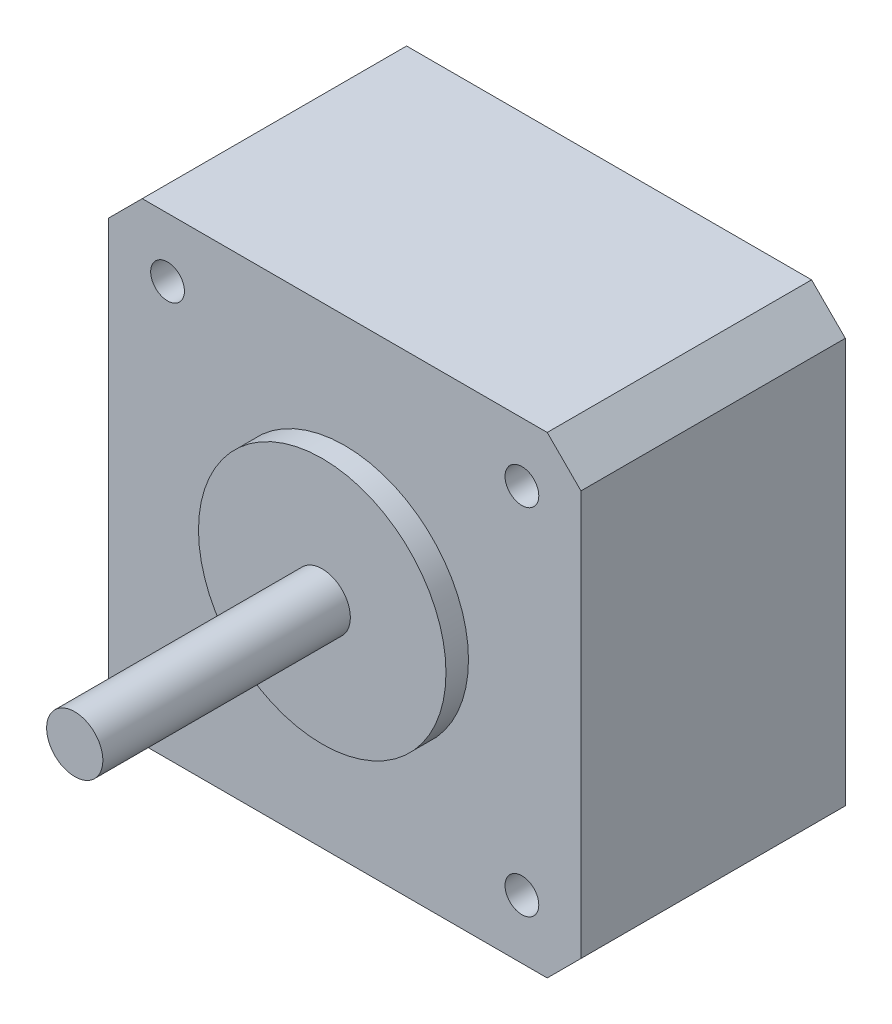
ISO-10303-21;
HEADER;
FILE_DESCRIPTION(('STEP AP214'),'2;1');
FILE_NAME('part.step','',(''),(''),'','','');
FILE_SCHEMA(('AUTOMOTIVE_DESIGN { 1 0 10303 214 1 1 1 1 }'));
ENDSEC;
DATA;
#1=APPLICATION_CONTEXT('core data for automotive mechanical design processes');
#2=APPLICATION_PROTOCOL_DEFINITION('international standard','automotive_design',2000,#1);
#3=PRODUCT_CONTEXT('',#1,'mechanical');
#4=PRODUCT('Part','Part','',(#3));
#5=PRODUCT_RELATED_PRODUCT_CATEGORY('part','',(#4));
#6=PRODUCT_DEFINITION_FORMATION('','',#4);
#7=PRODUCT_DEFINITION_CONTEXT('part definition',#1,'design');
#8=PRODUCT_DEFINITION('design','',#6,#7);
#9=PRODUCT_DEFINITION_SHAPE('','',#8);
#10=(LENGTH_UNIT() NAMED_UNIT(*) SI_UNIT(.MILLI.,.METRE.));
#11=(NAMED_UNIT(*) PLANE_ANGLE_UNIT() SI_UNIT($,.RADIAN.));
#12=(NAMED_UNIT(*) SI_UNIT($,.STERADIAN.) SOLID_ANGLE_UNIT());
#13=UNCERTAINTY_MEASURE_WITH_UNIT(LENGTH_MEASURE(1.E-05),#10,'distance_accuracy_value','');
#14=(GEOMETRIC_REPRESENTATION_CONTEXT(3) GLOBAL_UNCERTAINTY_ASSIGNED_CONTEXT((#13)) GLOBAL_UNIT_ASSIGNED_CONTEXT((#10,
#11,#12)) REPRESENTATION_CONTEXT('',''));
#15=CARTESIAN_POINT('',(0.,0.,0.));
#16=DIRECTION('',(0.,0.,1.));
#17=DIRECTION('',(1.,0.,0.));
#18=AXIS2_PLACEMENT_3D('',#15,#16,#17);
#19=CARTESIAN_POINT('',(0.,0.,25.5));
#20=DIRECTION('',(0.,0.,1.));
#21=DIRECTION('',(1.,0.,0.));
#22=AXIS2_PLACEMENT_3D('',#19,#20,#21);
#23=PLANE('',#22);
#24=CARTESIAN_POINT('',(0.,0.,25.5));
#25=DIRECTION('',(0.,0.,1.));
#26=DIRECTION('',(1.,0.,0.));
#27=AXIS2_PLACEMENT_3D('',#24,#25,#26);
#28=CIRCLE('',#27,11.);
#29=CARTESIAN_POINT('',(11.,0.,25.5));
#30=VERTEX_POINT('',#29);
#31=EDGE_CURVE('E162',#30,#30,#28,.T.);
#32=ORIENTED_EDGE('',*,*,#31,.T.);
#33=EDGE_LOOP('',(#32));
#34=FACE_BOUND('',#33,.T.);
#35=CARTESIAN_POINT('',(0.,0.,25.5));
#36=DIRECTION('',(0.,0.,1.));
#37=DIRECTION('',(1.,0.,0.));
#38=AXIS2_PLACEMENT_3D('',#35,#36,#37);
#39=CIRCLE('',#38,2.5);
#40=CARTESIAN_POINT('',(2.5,0.,25.5));
#41=VERTEX_POINT('',#40);
#42=EDGE_CURVE('E176',#41,#41,#39,.T.);
#43=ORIENTED_EDGE('',*,*,#42,.F.);
#44=EDGE_LOOP('',(#43));
#45=FACE_BOUND('',#44,.T.);
#46=ADVANCED_FACE('F32',(#34,#45),#23,.T.);
#47=CARTESIAN_POINT('',(0.,0.,23.5));
#48=DIRECTION('',(0.,0.,1.));
#49=DIRECTION('',(1.,0.,0.));
#50=AXIS2_PLACEMENT_3D('',#47,#48,#49);
#51=PLANE('',#50);
#52=CARTESIAN_POINT('',(15.75,-15.75,23.5));
#53=DIRECTION('',(0.,0.,1.));
#54=DIRECTION('',(1.,0.,0.));
#55=AXIS2_PLACEMENT_3D('',#52,#53,#54);
#56=CIRCLE('',#55,1.5);
#57=CARTESIAN_POINT('',(17.25,-15.75,23.5));
#58=VERTEX_POINT('',#57);
#59=EDGE_CURVE('E200',#58,#58,#56,.T.);
#60=ORIENTED_EDGE('',*,*,#59,.F.);
#61=EDGE_LOOP('',(#60));
#62=FACE_BOUND('',#61,.T.);
#63=CARTESIAN_POINT('',(-15.75,-15.75,23.5));
#64=DIRECTION('',(0.,0.,1.));
#65=DIRECTION('',(1.,0.,0.));
#66=AXIS2_PLACEMENT_3D('',#63,#64,#65);
#67=CIRCLE('',#66,1.5);
#68=CARTESIAN_POINT('',(-14.25,-15.75,23.5));
#69=VERTEX_POINT('',#68);
#70=EDGE_CURVE('E194',#69,#69,#67,.T.);
#71=ORIENTED_EDGE('',*,*,#70,.F.);
#72=EDGE_LOOP('',(#71));
#73=FACE_BOUND('',#72,.T.);
#74=CARTESIAN_POINT('',(15.75,15.75,23.5));
#75=DIRECTION('',(0.,0.,1.));
#76=DIRECTION('',(1.,0.,0.));
#77=AXIS2_PLACEMENT_3D('',#74,#75,#76);
#78=CIRCLE('',#77,1.5);
#79=CARTESIAN_POINT('',(17.25,15.75,23.5));
#80=VERTEX_POINT('',#79);
#81=EDGE_CURVE('E188',#80,#80,#78,.T.);
#82=ORIENTED_EDGE('',*,*,#81,.F.);
#83=EDGE_LOOP('',(#82));
#84=FACE_BOUND('',#83,.T.);
#85=CARTESIAN_POINT('',(-15.75,15.75,23.5));
#86=DIRECTION('',(0.,0.,1.));
#87=DIRECTION('',(1.,0.,0.));
#88=AXIS2_PLACEMENT_3D('',#85,#86,#87);
#89=CIRCLE('',#88,1.5);
#90=CARTESIAN_POINT('',(-14.25,15.75,23.5));
#91=VERTEX_POINT('',#90);
#92=EDGE_CURVE('E182',#91,#91,#89,.T.);
#93=ORIENTED_EDGE('',*,*,#92,.F.);
#94=EDGE_LOOP('',(#93));
#95=FACE_BOUND('',#94,.T.);
#96=DIRECTION('',(0.,-1.,0.));
#97=VECTOR('',#96,1.);
#98=CARTESIAN_POINT('',(-21.,21.,23.5));
#99=LINE('',#98,#97);
#100=CARTESIAN_POINT('',(-21.,18.,23.5));
#101=VERTEX_POINT('',#100);
#102=CARTESIAN_POINT('',(-21.,-18.,23.5));
#103=VERTEX_POINT('',#102);
#104=EDGE_CURVE('E169',#101,#103,#99,.T.);
#105=ORIENTED_EDGE('',*,*,#104,.T.);
#106=DIRECTION('',(-0.707106781186547,0.707106781186548,0.));
#107=VECTOR('',#106,1.);
#108=CARTESIAN_POINT('',(-19.5,-19.5,23.5));
#109=LINE('',#108,#107);
#110=CARTESIAN_POINT('',(-18.,-21.,23.5));
#111=VERTEX_POINT('',#110);
#112=EDGE_CURVE('E146',#103,#111,#109,.F.);
#113=ORIENTED_EDGE('',*,*,#112,.T.);
#114=DIRECTION('',(1.,0.,0.));
#115=VECTOR('',#114,1.);
#116=CARTESIAN_POINT('',(-21.,-21.,23.5));
#117=LINE('',#116,#115);
#118=CARTESIAN_POINT('',(18.,-21.,23.5));
#119=VERTEX_POINT('',#118);
#120=EDGE_CURVE('E118',#111,#119,#117,.T.);
#121=ORIENTED_EDGE('',*,*,#120,.T.);
#122=DIRECTION('',(-0.707106781186548,-0.707106781186547,0.));
#123=VECTOR('',#122,1.);
#124=CARTESIAN_POINT('',(19.5,-19.5,23.5));
#125=LINE('',#124,#123);
#126=CARTESIAN_POINT('',(21.,-18.,23.5));
#127=VERTEX_POINT('',#126);
#128=EDGE_CURVE('E144',#119,#127,#125,.F.);
#129=ORIENTED_EDGE('',*,*,#128,.T.);
#130=DIRECTION('',(0.,1.,0.));
#131=VECTOR('',#130,1.);
#132=CARTESIAN_POINT('',(21.,21.,23.5));
#133=LINE('',#132,#131);
#134=CARTESIAN_POINT('',(21.,18.,23.5));
#135=VERTEX_POINT('',#134);
#136=EDGE_CURVE('E124',#127,#135,#133,.T.);
#137=ORIENTED_EDGE('',*,*,#136,.T.);
#138=DIRECTION('',(0.707106781186546,-0.707106781186549,0.));
#139=VECTOR('',#138,1.);
#140=CARTESIAN_POINT('',(19.5,19.5,23.5));
#141=LINE('',#140,#139);
#142=CARTESIAN_POINT('',(18.,21.,23.5));
#143=VERTEX_POINT('',#142);
#144=EDGE_CURVE('E53',#135,#143,#141,.F.);
#145=ORIENTED_EDGE('',*,*,#144,.T.);
#146=DIRECTION('',(-1.,0.,0.));
#147=VECTOR('',#146,1.);
#148=CARTESIAN_POINT('',(-21.,21.,23.5));
#149=LINE('',#148,#147);
#150=CARTESIAN_POINT('',(-18.,21.,23.5));
#151=VERTEX_POINT('',#150);
#152=EDGE_CURVE('E127',#143,#151,#149,.T.);
#153=ORIENTED_EDGE('',*,*,#152,.T.);
#154=DIRECTION('',(0.707106781186549,0.707106781186546,0.));
#155=VECTOR('',#154,1.);
#156=CARTESIAN_POINT('',(-19.5,19.5,23.5));
#157=LINE('',#156,#155);
#158=EDGE_CURVE('E141',#151,#101,#157,.F.);
#159=ORIENTED_EDGE('',*,*,#158,.T.);
#160=EDGE_LOOP('',(#105,#113,#121,#129,#137,#145,#153,#159));
#161=FACE_BOUND('',#160,.T.);
#162=CARTESIAN_POINT('',(0.,0.,23.5));
#163=DIRECTION('',(0.,0.,1.));
#164=DIRECTION('',(1.,0.,0.));
#165=AXIS2_PLACEMENT_3D('',#162,#163,#164);
#166=CIRCLE('',#165,11.);
#167=CARTESIAN_POINT('',(11.,0.,23.5));
#168=VERTEX_POINT('',#167);
#169=EDGE_CURVE('E165',#168,#168,#166,.T.);
#170=ORIENTED_EDGE('',*,*,#169,.F.);
#171=EDGE_LOOP('',(#170));
#172=FACE_BOUND('',#171,.T.);
#173=ADVANCED_FACE('F215',(#62,#73,#84,#95,#161,#172),#51,.T.);
#174=CARTESIAN_POINT('',(21.,21.,23.5));
#175=DIRECTION('',(-1.,0.,0.));
#176=DIRECTION('',(0.,-1.,0.));
#177=AXIS2_PLACEMENT_3D('',#174,#175,#176);
#178=PLANE('',#177);
#179=ORIENTED_EDGE('',*,*,#136,.F.);
#180=DIRECTION('',(0.,0.,-1.));
#181=VECTOR('',#180,1.);
#182=CARTESIAN_POINT('',(21.,-18.,23.5));
#183=LINE('',#182,#181);
#184=CARTESIAN_POINT('',(21.,-18.,0.));
#185=VERTEX_POINT('',#184);
#186=EDGE_CURVE('E150',#127,#185,#183,.T.);
#187=ORIENTED_EDGE('',*,*,#186,.T.);
#188=DIRECTION('',(0.,1.,0.));
#189=VECTOR('',#188,1.);
#190=CARTESIAN_POINT('',(21.,21.,0.));
#191=LINE('',#190,#189);
#192=CARTESIAN_POINT('',(21.,18.,0.));
#193=VERTEX_POINT('',#192);
#194=EDGE_CURVE('E157',#185,#193,#191,.T.);
#195=ORIENTED_EDGE('',*,*,#194,.T.);
#196=DIRECTION('',(0.,0.,1.));
#197=VECTOR('',#196,1.);
#198=CARTESIAN_POINT('',(21.,18.,23.5));
#199=LINE('',#198,#197);
#200=EDGE_CURVE('E148',#193,#135,#199,.T.);
#201=ORIENTED_EDGE('',*,*,#200,.T.);
#202=EDGE_LOOP('',(#179,#187,#195,#201));
#203=FACE_BOUND('',#202,.T.);
#204=ADVANCED_FACE('F156',(#203),#178,.F.);
#205=CARTESIAN_POINT('',(-21.,21.,23.5));
#206=DIRECTION('',(0.,-1.,0.));
#207=DIRECTION('',(0.,0.,-1.));
#208=AXIS2_PLACEMENT_3D('',#205,#206,#207);
#209=PLANE('',#208);
#210=ORIENTED_EDGE('',*,*,#152,.F.);
#211=DIRECTION('',(0.,0.,-1.));
#212=VECTOR('',#211,1.);
#213=CARTESIAN_POINT('',(18.,21.,23.5));
#214=LINE('',#213,#212);
#215=CARTESIAN_POINT('',(18.,21.,0.));
#216=VERTEX_POINT('',#215);
#217=EDGE_CURVE('E11',#143,#216,#214,.T.);
#218=ORIENTED_EDGE('',*,*,#217,.T.);
#219=DIRECTION('',(-1.,0.,0.));
#220=VECTOR('',#219,1.);
#221=CARTESIAN_POINT('',(-21.,21.,0.));
#222=LINE('',#221,#220);
#223=CARTESIAN_POINT('',(-18.,21.,0.));
#224=VERTEX_POINT('',#223);
#225=EDGE_CURVE('E129',#216,#224,#222,.T.);
#226=ORIENTED_EDGE('',*,*,#225,.T.);
#227=DIRECTION('',(0.,0.,1.));
#228=VECTOR('',#227,1.);
#229=CARTESIAN_POINT('',(-18.,21.,23.5));
#230=LINE('',#229,#228);
#231=EDGE_CURVE('E40',#224,#151,#230,.T.);
#232=ORIENTED_EDGE('',*,*,#231,.T.);
#233=EDGE_LOOP('',(#210,#218,#226,#232));
#234=FACE_BOUND('',#233,.T.);
#235=ADVANCED_FACE('F377',(#234),#209,.F.);
#236=CARTESIAN_POINT('',(-21.,21.,23.5));
#237=DIRECTION('',(1.,0.,0.));
#238=DIRECTION('',(0.,1.,0.));
#239=AXIS2_PLACEMENT_3D('',#236,#237,#238);
#240=PLANE('',#239);
#241=DIRECTION('',(0.,-1.,0.));
#242=VECTOR('',#241,1.);
#243=CARTESIAN_POINT('',(-21.,21.,0.));
#244=LINE('',#243,#242);
#245=CARTESIAN_POINT('',(-21.,18.,0.));
#246=VERTEX_POINT('',#245);
#247=CARTESIAN_POINT('',(-21.,-18.,0.));
#248=VERTEX_POINT('',#247);
#249=EDGE_CURVE('E125',#246,#248,#244,.T.);
#250=ORIENTED_EDGE('',*,*,#249,.T.);
#251=DIRECTION('',(0.,0.,1.));
#252=VECTOR('',#251,1.);
#253=CARTESIAN_POINT('',(-21.,-18.,23.5));
#254=LINE('',#253,#252);
#255=EDGE_CURVE('E103',#248,#103,#254,.T.);
#256=ORIENTED_EDGE('',*,*,#255,.T.);
#257=ORIENTED_EDGE('',*,*,#104,.F.);
#258=DIRECTION('',(0.,0.,-1.));
#259=VECTOR('',#258,1.);
#260=CARTESIAN_POINT('',(-21.,18.,23.5));
#261=LINE('',#260,#259);
#262=EDGE_CURVE('E108',#101,#246,#261,.T.);
#263=ORIENTED_EDGE('',*,*,#262,.T.);
#264=EDGE_LOOP('',(#250,#256,#257,#263));
#265=FACE_BOUND('',#264,.T.);
#266=ADVANCED_FACE('F369',(#265),#240,.F.);
#267=CARTESIAN_POINT('',(-21.,-21.,23.5));
#268=DIRECTION('',(0.,1.,0.));
#269=DIRECTION('',(0.,0.,1.));
#270=AXIS2_PLACEMENT_3D('',#267,#268,#269);
#271=PLANE('',#270);
#272=ORIENTED_EDGE('',*,*,#120,.F.);
#273=DIRECTION('',(0.,0.,-1.));
#274=VECTOR('',#273,1.);
#275=CARTESIAN_POINT('',(-18.,-21.,23.5));
#276=LINE('',#275,#274);
#277=CARTESIAN_POINT('',(-18.,-21.,0.));
#278=VERTEX_POINT('',#277);
#279=EDGE_CURVE('E102',#111,#278,#276,.T.);
#280=ORIENTED_EDGE('',*,*,#279,.T.);
#281=DIRECTION('',(1.,0.,0.));
#282=VECTOR('',#281,1.);
#283=CARTESIAN_POINT('',(-21.,-21.,0.));
#284=LINE('',#283,#282);
#285=CARTESIAN_POINT('',(18.,-21.,0.));
#286=VERTEX_POINT('',#285);
#287=EDGE_CURVE('E115',#278,#286,#284,.T.);
#288=ORIENTED_EDGE('',*,*,#287,.T.);
#289=DIRECTION('',(0.,0.,1.));
#290=VECTOR('',#289,1.);
#291=CARTESIAN_POINT('',(18.,-21.,23.5));
#292=LINE('',#291,#290);
#293=EDGE_CURVE('E120',#286,#119,#292,.T.);
#294=ORIENTED_EDGE('',*,*,#293,.T.);
#295=EDGE_LOOP('',(#272,#280,#288,#294));
#296=FACE_BOUND('',#295,.T.);
#297=ADVANCED_FACE('F114',(#296),#271,.F.);
#298=CARTESIAN_POINT('',(0.,0.,0.));
#299=DIRECTION('',(0.,0.,1.));
#300=DIRECTION('',(1.,0.,0.));
#301=AXIS2_PLACEMENT_3D('',#298,#299,#300);
#302=PLANE('',#301);
#303=ORIENTED_EDGE('',*,*,#287,.F.);
#304=DIRECTION('',(0.707106781186547,-0.707106781186548,0.));
#305=VECTOR('',#304,1.);
#306=CARTESIAN_POINT('',(-18.,-21.,0.));
#307=LINE('',#306,#305);
#308=EDGE_CURVE('E98',#278,#248,#307,.F.);
#309=ORIENTED_EDGE('',*,*,#308,.T.);
#310=ORIENTED_EDGE('',*,*,#249,.F.);
#311=DIRECTION('',(-0.707106781186549,-0.707106781186546,0.));
#312=VECTOR('',#311,1.);
#313=CARTESIAN_POINT('',(-21.,18.,0.));
#314=LINE('',#313,#312);
#315=EDGE_CURVE('E119',#246,#224,#314,.F.);
#316=ORIENTED_EDGE('',*,*,#315,.T.);
#317=ORIENTED_EDGE('',*,*,#225,.F.);
#318=DIRECTION('',(-0.707106781186546,0.707106781186549,0.));
#319=VECTOR('',#318,1.);
#320=CARTESIAN_POINT('',(18.,21.,0.));
#321=LINE('',#320,#319);
#322=EDGE_CURVE('E135',#216,#193,#321,.F.);
#323=ORIENTED_EDGE('',*,*,#322,.T.);
#324=ORIENTED_EDGE('',*,*,#194,.F.);
#325=DIRECTION('',(0.707106781186548,0.707106781186547,0.));
#326=VECTOR('',#325,1.);
#327=CARTESIAN_POINT('',(21.,-18.,0.));
#328=LINE('',#327,#326);
#329=EDGE_CURVE('E109',#185,#286,#328,.F.);
#330=ORIENTED_EDGE('',*,*,#329,.T.);
#331=EDGE_LOOP('',(#303,#309,#310,#316,#317,#323,#324,#330));
#332=FACE_BOUND('',#331,.T.);
#333=ADVANCED_FACE('F122',(#332),#302,.F.);
#334=CARTESIAN_POINT('',(0.,0.,25.5));
#335=DIRECTION('',(0.,0.,-1.));
#336=DIRECTION('',(-1.,0.,0.));
#337=AXIS2_PLACEMENT_3D('',#334,#335,#336);
#338=CYLINDRICAL_SURFACE('',#337,11.);
#339=ORIENTED_EDGE('',*,*,#31,.F.);
#340=EDGE_LOOP('',(#339));
#341=FACE_BOUND('',#340,.T.);
#342=ORIENTED_EDGE('',*,*,#169,.T.);
#343=EDGE_LOOP('',(#342));
#344=FACE_BOUND('',#343,.T.);
#345=ADVANCED_FACE('F228',(#341,#344),#338,.T.);
#346=CARTESIAN_POINT('',(0.,0.,47.5));
#347=DIRECTION('',(0.,0.,-1.));
#348=DIRECTION('',(-1.,0.,0.));
#349=AXIS2_PLACEMENT_3D('',#346,#347,#348);
#350=CYLINDRICAL_SURFACE('',#349,2.5);
#351=CARTESIAN_POINT('',(0.,0.,47.5));
#352=DIRECTION('',(0.,0.,1.));
#353=DIRECTION('',(1.,0.,0.));
#354=AXIS2_PLACEMENT_3D('',#351,#352,#353);
#355=CIRCLE('',#354,2.5);
#356=CARTESIAN_POINT('',(2.5,0.,47.5));
#357=VERTEX_POINT('',#356);
#358=EDGE_CURVE('E174',#357,#357,#355,.T.);
#359=ORIENTED_EDGE('',*,*,#358,.F.);
#360=EDGE_LOOP('',(#359));
#361=FACE_BOUND('',#360,.T.);
#362=ORIENTED_EDGE('',*,*,#42,.T.);
#363=EDGE_LOOP('',(#362));
#364=FACE_BOUND('',#363,.T.);
#365=ADVANCED_FACE('F230',(#361,#364),#350,.T.);
#366=CARTESIAN_POINT('',(0.,0.,47.5));
#367=DIRECTION('',(0.,0.,1.));
#368=DIRECTION('',(1.,0.,0.));
#369=AXIS2_PLACEMENT_3D('',#366,#367,#368);
#370=PLANE('',#369);
#371=ORIENTED_EDGE('',*,*,#358,.T.);
#372=EDGE_LOOP('',(#371));
#373=FACE_BOUND('',#372,.T.);
#374=ADVANCED_FACE('F237',(#373),#370,.T.);
#375=CARTESIAN_POINT('',(-18.,-21.,23.5));
#376=DIRECTION('',(0.707106781186548,0.707106781186547,0.));
#377=DIRECTION('',(0.,0.,-1.));
#378=AXIS2_PLACEMENT_3D('',#375,#376,#377);
#379=PLANE('',#378);
#380=ORIENTED_EDGE('',*,*,#112,.F.);
#381=ORIENTED_EDGE('',*,*,#255,.F.);
#382=ORIENTED_EDGE('',*,*,#308,.F.);
#383=ORIENTED_EDGE('',*,*,#279,.F.);
#384=EDGE_LOOP('',(#380,#381,#382,#383));
#385=FACE_BOUND('',#384,.T.);
#386=ADVANCED_FACE('F101',(#385),#379,.F.);
#387=CARTESIAN_POINT('',(21.,-18.,23.5));
#388=DIRECTION('',(-0.707106781186547,0.707106781186548,0.));
#389=DIRECTION('',(0.,0.,-1.));
#390=AXIS2_PLACEMENT_3D('',#387,#388,#389);
#391=PLANE('',#390);
#392=ORIENTED_EDGE('',*,*,#128,.F.);
#393=ORIENTED_EDGE('',*,*,#293,.F.);
#394=ORIENTED_EDGE('',*,*,#329,.F.);
#395=ORIENTED_EDGE('',*,*,#186,.F.);
#396=EDGE_LOOP('',(#392,#393,#394,#395));
#397=FACE_BOUND('',#396,.T.);
#398=ADVANCED_FACE('F320',(#397),#391,.F.);
#399=CARTESIAN_POINT('',(18.,21.,23.5));
#400=DIRECTION('',(-0.707106781186549,-0.707106781186546,0.));
#401=DIRECTION('',(0.,0.,-1.));
#402=AXIS2_PLACEMENT_3D('',#399,#400,#401);
#403=PLANE('',#402);
#404=ORIENTED_EDGE('',*,*,#144,.F.);
#405=ORIENTED_EDGE('',*,*,#200,.F.);
#406=ORIENTED_EDGE('',*,*,#322,.F.);
#407=ORIENTED_EDGE('',*,*,#217,.F.);
#408=EDGE_LOOP('',(#404,#405,#406,#407));
#409=FACE_BOUND('',#408,.T.);
#410=ADVANCED_FACE('F313',(#409),#403,.F.);
#411=CARTESIAN_POINT('',(-21.,18.,23.5));
#412=DIRECTION('',(0.707106781186546,-0.707106781186549,0.));
#413=DIRECTION('',(0.,0.,-1.));
#414=AXIS2_PLACEMENT_3D('',#411,#412,#413);
#415=PLANE('',#414);
#416=ORIENTED_EDGE('',*,*,#158,.F.);
#417=ORIENTED_EDGE('',*,*,#231,.F.);
#418=ORIENTED_EDGE('',*,*,#315,.F.);
#419=ORIENTED_EDGE('',*,*,#262,.F.);
#420=EDGE_LOOP('',(#416,#417,#418,#419));
#421=FACE_BOUND('',#420,.T.);
#422=ADVANCED_FACE('F34',(#421),#415,.F.);
#423=CARTESIAN_POINT('',(-15.75,15.75,13.5));
#424=DIRECTION('',(0.,0.,1.));
#425=DIRECTION('',(1.,0.,0.));
#426=AXIS2_PLACEMENT_3D('',#423,#424,#425);
#427=CYLINDRICAL_SURFACE('',#426,1.5);
#428=CARTESIAN_POINT('',(-15.75,15.75,13.5));
#429=DIRECTION('',(0.,0.,1.));
#430=DIRECTION('',(1.,0.,0.));
#431=AXIS2_PLACEMENT_3D('',#428,#429,#430);
#432=CIRCLE('',#431,1.5);
#433=CARTESIAN_POINT('',(-14.25,15.75,13.5));
#434=VERTEX_POINT('',#433);
#435=EDGE_CURVE('E179',#434,#434,#432,.T.);
#436=ORIENTED_EDGE('',*,*,#435,.F.);
#437=EDGE_LOOP('',(#436));
#438=FACE_BOUND('',#437,.T.);
#439=ORIENTED_EDGE('',*,*,#92,.T.);
#440=EDGE_LOOP('',(#439));
#441=FACE_BOUND('',#440,.T.);
#442=ADVANCED_FACE('F252',(#438,#441),#427,.F.);
#443=CARTESIAN_POINT('',(-15.75,15.75,13.5));
#444=DIRECTION('',(0.,0.,1.));
#445=DIRECTION('',(1.,0.,0.));
#446=AXIS2_PLACEMENT_3D('',#443,#444,#445);
#447=PLANE('',#446);
#448=ORIENTED_EDGE('',*,*,#435,.T.);
#449=EDGE_LOOP('',(#448));
#450=FACE_BOUND('',#449,.T.);
#451=ADVANCED_FACE('F255',(#450),#447,.T.);
#452=CARTESIAN_POINT('',(15.75,15.75,13.5));
#453=DIRECTION('',(0.,0.,1.));
#454=DIRECTION('',(1.,0.,0.));
#455=AXIS2_PLACEMENT_3D('',#452,#453,#454);
#456=CYLINDRICAL_SURFACE('',#455,1.5);
#457=CARTESIAN_POINT('',(15.75,15.75,13.5));
#458=DIRECTION('',(0.,0.,1.));
#459=DIRECTION('',(1.,0.,0.));
#460=AXIS2_PLACEMENT_3D('',#457,#458,#459);
#461=CIRCLE('',#460,1.5);
#462=CARTESIAN_POINT('',(17.25,15.75,13.5));
#463=VERTEX_POINT('',#462);
#464=EDGE_CURVE('E185',#463,#463,#461,.T.);
#465=ORIENTED_EDGE('',*,*,#464,.F.);
#466=EDGE_LOOP('',(#465));
#467=FACE_BOUND('',#466,.T.);
#468=ORIENTED_EDGE('',*,*,#81,.T.);
#469=EDGE_LOOP('',(#468));
#470=FACE_BOUND('',#469,.T.);
#471=ADVANCED_FACE('F259',(#467,#470),#456,.F.);
#472=CARTESIAN_POINT('',(15.75,15.75,13.5));
#473=DIRECTION('',(0.,0.,1.));
#474=DIRECTION('',(1.,0.,0.));
#475=AXIS2_PLACEMENT_3D('',#472,#473,#474);
#476=PLANE('',#475);
#477=ORIENTED_EDGE('',*,*,#464,.T.);
#478=EDGE_LOOP('',(#477));
#479=FACE_BOUND('',#478,.T.);
#480=ADVANCED_FACE('F263',(#479),#476,.T.);
#481=CARTESIAN_POINT('',(-15.75,-15.75,13.5));
#482=DIRECTION('',(0.,0.,1.));
#483=DIRECTION('',(1.,0.,0.));
#484=AXIS2_PLACEMENT_3D('',#481,#482,#483);
#485=CYLINDRICAL_SURFACE('',#484,1.5);
#486=CARTESIAN_POINT('',(-15.75,-15.75,13.5));
#487=DIRECTION('',(0.,0.,1.));
#488=DIRECTION('',(1.,0.,0.));
#489=AXIS2_PLACEMENT_3D('',#486,#487,#488);
#490=CIRCLE('',#489,1.5);
#491=CARTESIAN_POINT('',(-14.25,-15.75,13.5));
#492=VERTEX_POINT('',#491);
#493=EDGE_CURVE('E191',#492,#492,#490,.T.);
#494=ORIENTED_EDGE('',*,*,#493,.F.);
#495=EDGE_LOOP('',(#494));
#496=FACE_BOUND('',#495,.T.);
#497=ORIENTED_EDGE('',*,*,#70,.T.);
#498=EDGE_LOOP('',(#497));
#499=FACE_BOUND('',#498,.T.);
#500=ADVANCED_FACE('F267',(#496,#499),#485,.F.);
#501=CARTESIAN_POINT('',(-15.75,-15.75,13.5));
#502=DIRECTION('',(0.,0.,1.));
#503=DIRECTION('',(1.,0.,0.));
#504=AXIS2_PLACEMENT_3D('',#501,#502,#503);
#505=PLANE('',#504);
#506=ORIENTED_EDGE('',*,*,#493,.T.);
#507=EDGE_LOOP('',(#506));
#508=FACE_BOUND('',#507,.T.);
#509=ADVANCED_FACE('F211',(#508),#505,.T.);
#510=CARTESIAN_POINT('',(15.75,-15.75,13.5));
#511=DIRECTION('',(0.,0.,1.));
#512=DIRECTION('',(1.,0.,0.));
#513=AXIS2_PLACEMENT_3D('',#510,#511,#512);
#514=CYLINDRICAL_SURFACE('',#513,1.5);
#515=CARTESIAN_POINT('',(15.75,-15.75,13.5));
#516=DIRECTION('',(0.,0.,1.));
#517=DIRECTION('',(1.,0.,0.));
#518=AXIS2_PLACEMENT_3D('',#515,#516,#517);
#519=CIRCLE('',#518,1.5);
#520=CARTESIAN_POINT('',(17.25,-15.75,13.5));
#521=VERTEX_POINT('',#520);
#522=EDGE_CURVE('E197',#521,#521,#519,.T.);
#523=ORIENTED_EDGE('',*,*,#522,.F.);
#524=EDGE_LOOP('',(#523));
#525=FACE_BOUND('',#524,.T.);
#526=ORIENTED_EDGE('',*,*,#59,.T.);
#527=EDGE_LOOP('',(#526));
#528=FACE_BOUND('',#527,.T.);
#529=ADVANCED_FACE('F208',(#525,#528),#514,.F.);
#530=CARTESIAN_POINT('',(15.75,-15.75,13.5));
#531=DIRECTION('',(0.,0.,1.));
#532=DIRECTION('',(1.,0.,0.));
#533=AXIS2_PLACEMENT_3D('',#530,#531,#532);
#534=PLANE('',#533);
#535=ORIENTED_EDGE('',*,*,#522,.T.);
#536=EDGE_LOOP('',(#535));
#537=FACE_BOUND('',#536,.T.);
#538=ADVANCED_FACE('F206',(#537),#534,.T.);
#539=CLOSED_SHELL('',(#46,#173,#204,#235,#266,#297,#333,#345,#365,#374,#386,#398,#410,#422,#442,
#451,#471,#480,#500,#509,#529,#538));
#540=MANIFOLD_SOLID_BREP('B2',#539);
#541=ADVANCED_BREP_SHAPE_REPRESENTATION('',(#18,#540),#14);
#542=SHAPE_DEFINITION_REPRESENTATION(#9,#541);
ENDSEC;
END-ISO-10303-21;
